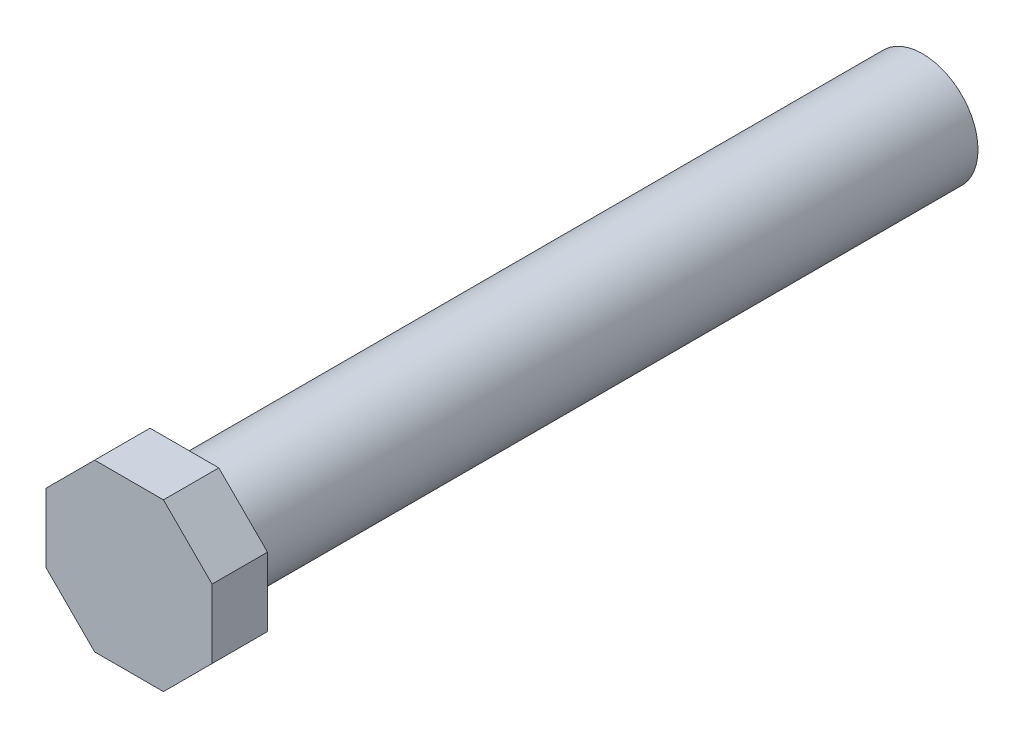
ISO-10303-21;
HEADER;
FILE_DESCRIPTION(('STEP AP214'),'2;1');
FILE_NAME('part.step','',(''),(''),'','','');
FILE_SCHEMA(('AUTOMOTIVE_DESIGN { 1 0 10303 214 1 1 1 1 }'));
ENDSEC;
DATA;
#1=APPLICATION_CONTEXT('core data for automotive mechanical design processes');
#2=APPLICATION_PROTOCOL_DEFINITION('international standard','automotive_design',2000,#1);
#3=PRODUCT_CONTEXT('',#1,'mechanical');
#4=PRODUCT('Part','Part','',(#3));
#5=PRODUCT_RELATED_PRODUCT_CATEGORY('part','',(#4));
#6=PRODUCT_DEFINITION_FORMATION('','',#4);
#7=PRODUCT_DEFINITION_CONTEXT('part definition',#1,'design');
#8=PRODUCT_DEFINITION('design','',#6,#7);
#9=PRODUCT_DEFINITION_SHAPE('','',#8);
#10=(LENGTH_UNIT() NAMED_UNIT(*) SI_UNIT(.MILLI.,.METRE.));
#11=(NAMED_UNIT(*) PLANE_ANGLE_UNIT() SI_UNIT($,.RADIAN.));
#12=(NAMED_UNIT(*) SI_UNIT($,.STERADIAN.) SOLID_ANGLE_UNIT());
#13=UNCERTAINTY_MEASURE_WITH_UNIT(LENGTH_MEASURE(1.E-05),#10,'distance_accuracy_value','');
#14=(GEOMETRIC_REPRESENTATION_CONTEXT(3) GLOBAL_UNCERTAINTY_ASSIGNED_CONTEXT((#13)) GLOBAL_UNIT_ASSIGNED_CONTEXT((#10,
#11,#12)) REPRESENTATION_CONTEXT('',''));
#15=CARTESIAN_POINT('',(0.,0.,0.));
#16=DIRECTION('',(0.,0.,1.));
#17=DIRECTION('',(1.,0.,0.));
#18=AXIS2_PLACEMENT_3D('',#15,#16,#17);
#19=CARTESIAN_POINT('',(0.,0.,40.));
#20=DIRECTION('',(0.,0.,-1.));
#21=DIRECTION('',(-1.,0.,0.));
#22=AXIS2_PLACEMENT_3D('',#19,#20,#21);
#23=CYLINDRICAL_SURFACE('',#22,3.);
#24=CARTESIAN_POINT('',(0.,0.,40.));
#25=DIRECTION('',(0.,0.,1.));
#26=DIRECTION('',(1.,0.,0.));
#27=AXIS2_PLACEMENT_3D('',#24,#25,#26);
#28=CIRCLE('',#27,3.);
#29=CARTESIAN_POINT('',(3.,0.,40.));
#30=VERTEX_POINT('',#29);
#31=EDGE_CURVE('E11',#30,#30,#28,.T.);
#32=ORIENTED_EDGE('',*,*,#31,.F.);
#33=EDGE_LOOP('',(#32));
#34=FACE_BOUND('',#33,.T.);
#35=CARTESIAN_POINT('',(0.,0.,0.));
#36=DIRECTION('',(0.,0.,1.));
#37=DIRECTION('',(1.,0.,0.));
#38=AXIS2_PLACEMENT_3D('',#35,#36,#37);
#39=CIRCLE('',#38,3.);
#40=CARTESIAN_POINT('',(3.,0.,0.));
#41=VERTEX_POINT('',#40);
#42=EDGE_CURVE('E39',#41,#41,#39,.T.);
#43=ORIENTED_EDGE('',*,*,#42,.T.);
#44=EDGE_LOOP('',(#43));
#45=FACE_BOUND('',#44,.T.);
#46=ADVANCED_FACE('F36',(#34,#45),#23,.T.);
#47=CARTESIAN_POINT('',(0.,0.,0.));
#48=DIRECTION('',(0.,0.,1.));
#49=DIRECTION('',(1.,0.,0.));
#50=AXIS2_PLACEMENT_3D('',#47,#48,#49);
#51=PLANE('',#50);
#52=ORIENTED_EDGE('',*,*,#42,.F.);
#53=EDGE_LOOP('',(#52));
#54=FACE_BOUND('',#53,.T.);
#55=ADVANCED_FACE('F166',(#54),#51,.F.);
#56=CARTESIAN_POINT('',(1.86396103067893,-4.5,43.));
#57=DIRECTION('',(-0.707106781186548,0.707106781186547,0.));
#58=DIRECTION('',(-0.707106781186547,-0.707106781186548,0.));
#59=AXIS2_PLACEMENT_3D('',#56,#57,#58);
#60=PLANE('',#59);
#61=DIRECTION('',(0.707106781186547,0.707106781186548,0.));
#62=VECTOR('',#61,1.);
#63=CARTESIAN_POINT('',(1.86396103067893,-4.5,40.));
#64=LINE('',#63,#62);
#65=CARTESIAN_POINT('',(1.86396103067893,-4.5,40.));
#66=VERTEX_POINT('',#65);
#67=CARTESIAN_POINT('',(4.5,-1.86396103067893,40.));
#68=VERTEX_POINT('',#67);
#69=EDGE_CURVE('E133',#66,#68,#64,.T.);
#70=ORIENTED_EDGE('',*,*,#69,.T.);
#71=DIRECTION('',(0.,0.,-1.));
#72=VECTOR('',#71,1.);
#73=CARTESIAN_POINT('',(4.5,-1.86396103067893,43.));
#74=LINE('',#73,#72);
#75=CARTESIAN_POINT('',(4.5,-1.86396103067893,43.));
#76=VERTEX_POINT('',#75);
#77=EDGE_CURVE('E160',#76,#68,#74,.T.);
#78=ORIENTED_EDGE('',*,*,#77,.F.);
#79=DIRECTION('',(0.707106781186547,0.707106781186548,0.));
#80=VECTOR('',#79,1.);
#81=CARTESIAN_POINT('',(1.86396103067893,-4.5,43.));
#82=LINE('',#81,#80);
#83=CARTESIAN_POINT('',(1.86396103067893,-4.5,43.));
#84=VERTEX_POINT('',#83);
#85=EDGE_CURVE('E147',#84,#76,#82,.T.);
#86=ORIENTED_EDGE('',*,*,#85,.F.);
#87=DIRECTION('',(0.,0.,-1.));
#88=VECTOR('',#87,1.);
#89=CARTESIAN_POINT('',(1.86396103067893,-4.5,43.));
#90=LINE('',#89,#88);
#91=EDGE_CURVE('E129',#84,#66,#90,.T.);
#92=ORIENTED_EDGE('',*,*,#91,.T.);
#93=EDGE_LOOP('',(#70,#78,#86,#92));
#94=FACE_BOUND('',#93,.T.);
#95=ADVANCED_FACE('F168',(#94),#60,.F.);
#96=CARTESIAN_POINT('',(4.5,-1.86396103067893,43.));
#97=DIRECTION('',(-1.,0.,0.));
#98=DIRECTION('',(0.,-1.,0.));
#99=AXIS2_PLACEMENT_3D('',#96,#97,#98);
#100=PLANE('',#99);
#101=DIRECTION('',(0.,1.,0.));
#102=VECTOR('',#101,1.);
#103=CARTESIAN_POINT('',(4.5,-1.86396103067893,40.));
#104=LINE('',#103,#102);
#105=CARTESIAN_POINT('',(4.5,1.86396103067893,40.));
#106=VERTEX_POINT('',#105);
#107=EDGE_CURVE('E136',#68,#106,#104,.T.);
#108=ORIENTED_EDGE('',*,*,#107,.T.);
#109=DIRECTION('',(0.,0.,-1.));
#110=VECTOR('',#109,1.);
#111=CARTESIAN_POINT('',(4.5,1.86396103067893,43.));
#112=LINE('',#111,#110);
#113=CARTESIAN_POINT('',(4.5,1.86396103067893,43.));
#114=VERTEX_POINT('',#113);
#115=EDGE_CURVE('E157',#114,#106,#112,.T.);
#116=ORIENTED_EDGE('',*,*,#115,.F.);
#117=DIRECTION('',(0.,1.,0.));
#118=VECTOR('',#117,1.);
#119=CARTESIAN_POINT('',(4.5,-1.86396103067893,43.));
#120=LINE('',#119,#118);
#121=EDGE_CURVE('E96',#76,#114,#120,.T.);
#122=ORIENTED_EDGE('',*,*,#121,.F.);
#123=ORIENTED_EDGE('',*,*,#77,.T.);
#124=EDGE_LOOP('',(#108,#116,#122,#123));
#125=FACE_BOUND('',#124,.T.);
#126=ADVANCED_FACE('F173',(#125),#100,.F.);
#127=CARTESIAN_POINT('',(4.5,1.86396103067893,43.));
#128=DIRECTION('',(-0.707106781186547,-0.707106781186548,0.));
#129=DIRECTION('',(0.707106781186548,-0.707106781186547,0.));
#130=AXIS2_PLACEMENT_3D('',#127,#128,#129);
#131=PLANE('',#130);
#132=DIRECTION('',(-0.707106781186548,0.707106781186547,0.));
#133=VECTOR('',#132,1.);
#134=CARTESIAN_POINT('',(4.5,1.86396103067893,40.));
#135=LINE('',#134,#133);
#136=CARTESIAN_POINT('',(1.86396103067892,4.5,40.));
#137=VERTEX_POINT('',#136);
#138=EDGE_CURVE('E138',#106,#137,#135,.T.);
#139=ORIENTED_EDGE('',*,*,#138,.T.);
#140=DIRECTION('',(0.,0.,-1.));
#141=VECTOR('',#140,1.);
#142=CARTESIAN_POINT('',(1.86396103067892,4.5,43.));
#143=LINE('',#142,#141);
#144=CARTESIAN_POINT('',(1.86396103067892,4.5,43.));
#145=VERTEX_POINT('',#144);
#146=EDGE_CURVE('E154',#145,#137,#143,.T.);
#147=ORIENTED_EDGE('',*,*,#146,.F.);
#148=DIRECTION('',(-0.707106781186548,0.707106781186547,0.));
#149=VECTOR('',#148,1.);
#150=CARTESIAN_POINT('',(4.5,1.86396103067893,43.));
#151=LINE('',#150,#149);
#152=EDGE_CURVE('E284',#114,#145,#151,.T.);
#153=ORIENTED_EDGE('',*,*,#152,.F.);
#154=ORIENTED_EDGE('',*,*,#115,.T.);
#155=EDGE_LOOP('',(#139,#147,#153,#154));
#156=FACE_BOUND('',#155,.T.);
#157=ADVANCED_FACE('F180',(#156),#131,.F.);
#158=CARTESIAN_POINT('',(1.86396103067892,4.5,43.));
#159=DIRECTION('',(0.,-1.,0.));
#160=DIRECTION('',(1.,0.,0.));
#161=AXIS2_PLACEMENT_3D('',#158,#159,#160);
#162=PLANE('',#161);
#163=DIRECTION('',(-1.,0.,0.));
#164=VECTOR('',#163,1.);
#165=CARTESIAN_POINT('',(1.86396103067892,4.5,40.));
#166=LINE('',#165,#164);
#167=CARTESIAN_POINT('',(-1.86396103067893,4.5,40.));
#168=VERTEX_POINT('',#167);
#169=EDGE_CURVE('E140',#137,#168,#166,.T.);
#170=ORIENTED_EDGE('',*,*,#169,.T.);
#171=DIRECTION('',(0.,0.,-1.));
#172=VECTOR('',#171,1.);
#173=CARTESIAN_POINT('',(-1.86396103067893,4.5,43.));
#174=LINE('',#173,#172);
#175=CARTESIAN_POINT('',(-1.86396103067893,4.5,43.));
#176=VERTEX_POINT('',#175);
#177=EDGE_CURVE('E151',#176,#168,#174,.T.);
#178=ORIENTED_EDGE('',*,*,#177,.F.);
#179=DIRECTION('',(-1.,0.,0.));
#180=VECTOR('',#179,1.);
#181=CARTESIAN_POINT('',(1.86396103067892,4.5,43.));
#182=LINE('',#181,#180);
#183=EDGE_CURVE('E288',#145,#176,#182,.T.);
#184=ORIENTED_EDGE('',*,*,#183,.F.);
#185=ORIENTED_EDGE('',*,*,#146,.T.);
#186=EDGE_LOOP('',(#170,#178,#184,#185));
#187=FACE_BOUND('',#186,.T.);
#188=ADVANCED_FACE('F183',(#187),#162,.F.);
#189=CARTESIAN_POINT('',(-1.86396103067893,4.5,43.));
#190=DIRECTION('',(0.707106781186548,-0.707106781186547,0.));
#191=DIRECTION('',(0.707106781186547,0.707106781186548,0.));
#192=AXIS2_PLACEMENT_3D('',#189,#190,#191);
#193=PLANE('',#192);
#194=DIRECTION('',(-0.707106781186547,-0.707106781186548,0.));
#195=VECTOR('',#194,1.);
#196=CARTESIAN_POINT('',(-1.86396103067893,4.5,40.));
#197=LINE('',#196,#195);
#198=CARTESIAN_POINT('',(-4.5,1.86396103067892,40.));
#199=VERTEX_POINT('',#198);
#200=EDGE_CURVE('E142',#168,#199,#197,.T.);
#201=ORIENTED_EDGE('',*,*,#200,.T.);
#202=DIRECTION('',(0.,0.,-1.));
#203=VECTOR('',#202,1.);
#204=CARTESIAN_POINT('',(-4.5,1.86396103067892,43.));
#205=LINE('',#204,#203);
#206=CARTESIAN_POINT('',(-4.5,1.86396103067892,43.));
#207=VERTEX_POINT('',#206);
#208=EDGE_CURVE('E124',#207,#199,#205,.T.);
#209=ORIENTED_EDGE('',*,*,#208,.F.);
#210=DIRECTION('',(-0.707106781186547,-0.707106781186548,0.));
#211=VECTOR('',#210,1.);
#212=CARTESIAN_POINT('',(-1.86396103067893,4.5,43.));
#213=LINE('',#212,#211);
#214=EDGE_CURVE('E115',#176,#207,#213,.T.);
#215=ORIENTED_EDGE('',*,*,#214,.F.);
#216=ORIENTED_EDGE('',*,*,#177,.T.);
#217=EDGE_LOOP('',(#201,#209,#215,#216));
#218=FACE_BOUND('',#217,.T.);
#219=ADVANCED_FACE('F187',(#218),#193,.F.);
#220=CARTESIAN_POINT('',(-4.5,1.86396103067892,43.));
#221=DIRECTION('',(1.,0.,0.));
#222=DIRECTION('',(0.,1.,0.));
#223=AXIS2_PLACEMENT_3D('',#220,#221,#222);
#224=PLANE('',#223);
#225=DIRECTION('',(0.,-1.,0.));
#226=VECTOR('',#225,1.);
#227=CARTESIAN_POINT('',(-4.5,1.86396103067892,40.));
#228=LINE('',#227,#226);
#229=CARTESIAN_POINT('',(-4.5,-1.86396103067893,40.));
#230=VERTEX_POINT('',#229);
#231=EDGE_CURVE('E123',#199,#230,#228,.T.);
#232=ORIENTED_EDGE('',*,*,#231,.T.);
#233=DIRECTION('',(0.,0.,-1.));
#234=VECTOR('',#233,1.);
#235=CARTESIAN_POINT('',(-4.5,-1.86396103067893,43.));
#236=LINE('',#235,#234);
#237=CARTESIAN_POINT('',(-4.5,-1.86396103067893,43.));
#238=VERTEX_POINT('',#237);
#239=EDGE_CURVE('E120',#238,#230,#236,.T.);
#240=ORIENTED_EDGE('',*,*,#239,.F.);
#241=DIRECTION('',(0.,-1.,0.));
#242=VECTOR('',#241,1.);
#243=CARTESIAN_POINT('',(-4.5,1.86396103067892,43.));
#244=LINE('',#243,#242);
#245=EDGE_CURVE('E109',#207,#238,#244,.T.);
#246=ORIENTED_EDGE('',*,*,#245,.F.);
#247=ORIENTED_EDGE('',*,*,#208,.T.);
#248=EDGE_LOOP('',(#232,#240,#246,#247));
#249=FACE_BOUND('',#248,.T.);
#250=ADVANCED_FACE('F121',(#249),#224,.F.);
#251=CARTESIAN_POINT('',(-4.5,-1.86396103067893,43.));
#252=DIRECTION('',(0.707106781186548,0.707106781186547,0.));
#253=DIRECTION('',(-0.707106781186547,0.707106781186548,0.));
#254=AXIS2_PLACEMENT_3D('',#251,#252,#253);
#255=PLANE('',#254);
#256=DIRECTION('',(0.707106781186547,-0.707106781186548,0.));
#257=VECTOR('',#256,1.);
#258=CARTESIAN_POINT('',(-4.5,-1.86396103067893,40.));
#259=LINE('',#258,#257);
#260=CARTESIAN_POINT('',(-1.86396103067893,-4.5,40.));
#261=VERTEX_POINT('',#260);
#262=EDGE_CURVE('E81',#230,#261,#259,.T.);
#263=ORIENTED_EDGE('',*,*,#262,.T.);
#264=DIRECTION('',(0.,0.,-1.));
#265=VECTOR('',#264,1.);
#266=CARTESIAN_POINT('',(-1.86396103067893,-4.5,43.));
#267=LINE('',#266,#265);
#268=CARTESIAN_POINT('',(-1.86396103067893,-4.5,43.));
#269=VERTEX_POINT('',#268);
#270=EDGE_CURVE('E125',#269,#261,#267,.T.);
#271=ORIENTED_EDGE('',*,*,#270,.F.);
#272=DIRECTION('',(0.707106781186547,-0.707106781186548,0.));
#273=VECTOR('',#272,1.);
#274=CARTESIAN_POINT('',(-4.5,-1.86396103067893,43.));
#275=LINE('',#274,#273);
#276=EDGE_CURVE('E113',#238,#269,#275,.T.);
#277=ORIENTED_EDGE('',*,*,#276,.F.);
#278=ORIENTED_EDGE('',*,*,#239,.T.);
#279=EDGE_LOOP('',(#263,#271,#277,#278));
#280=FACE_BOUND('',#279,.T.);
#281=ADVANCED_FACE('F127',(#280),#255,.F.);
#282=CARTESIAN_POINT('',(-1.86396103067893,-4.5,43.));
#283=DIRECTION('',(0.,1.,0.));
#284=DIRECTION('',(-1.,0.,0.));
#285=AXIS2_PLACEMENT_3D('',#282,#283,#284);
#286=PLANE('',#285);
#287=DIRECTION('',(1.,0.,0.));
#288=VECTOR('',#287,1.);
#289=CARTESIAN_POINT('',(-1.86396103067893,-4.5,40.));
#290=LINE('',#289,#288);
#291=EDGE_CURVE('E87',#261,#66,#290,.T.);
#292=ORIENTED_EDGE('',*,*,#291,.T.);
#293=ORIENTED_EDGE('',*,*,#91,.F.);
#294=DIRECTION('',(1.,0.,0.));
#295=VECTOR('',#294,1.);
#296=CARTESIAN_POINT('',(-1.86396103067893,-4.5,43.));
#297=LINE('',#296,#295);
#298=EDGE_CURVE('E52',#269,#84,#297,.T.);
#299=ORIENTED_EDGE('',*,*,#298,.F.);
#300=ORIENTED_EDGE('',*,*,#270,.T.);
#301=EDGE_LOOP('',(#292,#293,#299,#300));
#302=FACE_BOUND('',#301,.T.);
#303=ADVANCED_FACE('F196',(#302),#286,.F.);
#304=CARTESIAN_POINT('',(0.,0.,43.));
#305=DIRECTION('',(0.,0.,1.));
#306=DIRECTION('',(1.,0.,0.));
#307=AXIS2_PLACEMENT_3D('',#304,#305,#306);
#308=PLANE('',#307);
#309=ORIENTED_EDGE('',*,*,#85,.T.);
#310=ORIENTED_EDGE('',*,*,#121,.T.);
#311=ORIENTED_EDGE('',*,*,#152,.T.);
#312=ORIENTED_EDGE('',*,*,#183,.T.);
#313=ORIENTED_EDGE('',*,*,#214,.T.);
#314=ORIENTED_EDGE('',*,*,#245,.T.);
#315=ORIENTED_EDGE('',*,*,#276,.T.);
#316=ORIENTED_EDGE('',*,*,#298,.T.);
#317=EDGE_LOOP('',(#309,#310,#311,#312,#313,#314,#315,#316));
#318=FACE_BOUND('',#317,.T.);
#319=ADVANCED_FACE('F111',(#318),#308,.T.);
#320=CARTESIAN_POINT('',(0.,0.,40.));
#321=DIRECTION('',(0.,0.,1.));
#322=DIRECTION('',(1.,0.,0.));
#323=AXIS2_PLACEMENT_3D('',#320,#321,#322);
#324=PLANE('',#323);
#325=ORIENTED_EDGE('',*,*,#31,.T.);
#326=EDGE_LOOP('',(#325));
#327=FACE_BOUND('',#326,.T.);
#328=ORIENTED_EDGE('',*,*,#69,.F.);
#329=ORIENTED_EDGE('',*,*,#291,.F.);
#330=ORIENTED_EDGE('',*,*,#262,.F.);
#331=ORIENTED_EDGE('',*,*,#231,.F.);
#332=ORIENTED_EDGE('',*,*,#200,.F.);
#333=ORIENTED_EDGE('',*,*,#169,.F.);
#334=ORIENTED_EDGE('',*,*,#138,.F.);
#335=ORIENTED_EDGE('',*,*,#107,.F.);
#336=EDGE_LOOP('',(#328,#329,#330,#331,#332,#333,#334,#335));
#337=FACE_BOUND('',#336,.T.);
#338=ADVANCED_FACE('F199',(#327,#337),#324,.F.);
#339=CLOSED_SHELL('',(#46,#55,#95,#126,#157,#188,#219,#250,#281,#303,#319,#338));
#340=MANIFOLD_SOLID_BREP('B2',#339);
#341=ADVANCED_BREP_SHAPE_REPRESENTATION('',(#18,#340),#14);
#342=SHAPE_DEFINITION_REPRESENTATION(#9,#341);
ENDSEC;
END-ISO-10303-21;
